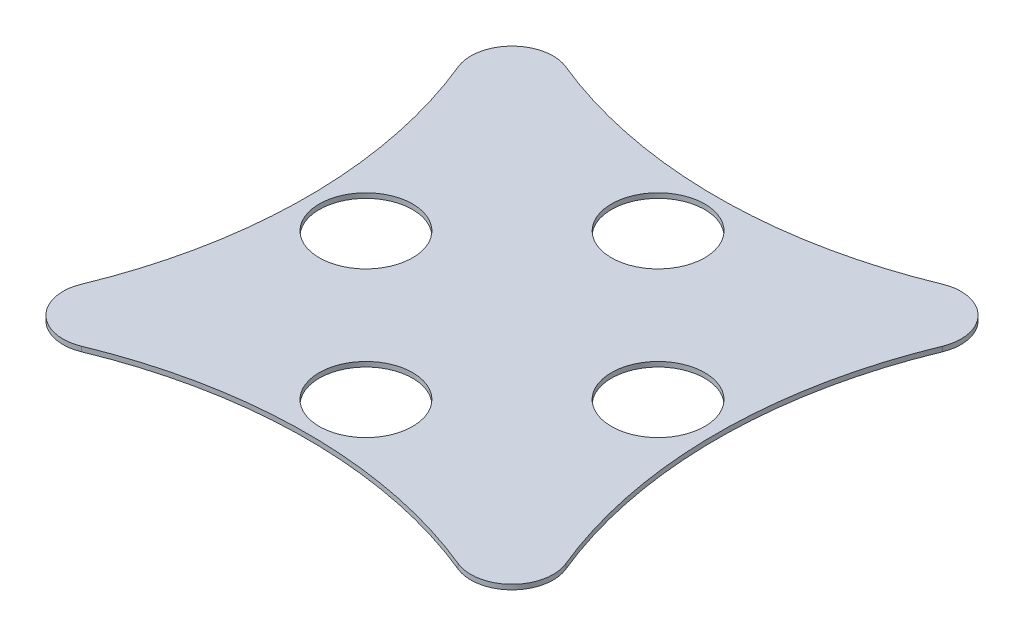
ISO-10303-21;
HEADER;
FILE_DESCRIPTION(('STEP AP214'),'2;1');
FILE_NAME('part.step','',(''),(''),'','','');
FILE_SCHEMA(('AUTOMOTIVE_DESIGN { 1 0 10303 214 1 1 1 1 }'));
ENDSEC;
DATA;
#1=APPLICATION_CONTEXT('core data for automotive mechanical design processes');
#2=APPLICATION_PROTOCOL_DEFINITION('international standard','automotive_design',2000,#1);
#3=PRODUCT_CONTEXT('',#1,'mechanical');
#4=PRODUCT('Part','Part','',(#3));
#5=PRODUCT_RELATED_PRODUCT_CATEGORY('part','',(#4));
#6=PRODUCT_DEFINITION_FORMATION('','',#4);
#7=PRODUCT_DEFINITION_CONTEXT('part definition',#1,'design');
#8=PRODUCT_DEFINITION('design','',#6,#7);
#9=PRODUCT_DEFINITION_SHAPE('','',#8);
#10=(LENGTH_UNIT() NAMED_UNIT(*) SI_UNIT(.MILLI.,.METRE.));
#11=(NAMED_UNIT(*) PLANE_ANGLE_UNIT() SI_UNIT($,.RADIAN.));
#12=(NAMED_UNIT(*) SI_UNIT($,.STERADIAN.) SOLID_ANGLE_UNIT());
#13=UNCERTAINTY_MEASURE_WITH_UNIT(LENGTH_MEASURE(1.E-05),#10,'distance_accuracy_value','');
#14=(GEOMETRIC_REPRESENTATION_CONTEXT(3) GLOBAL_UNCERTAINTY_ASSIGNED_CONTEXT((#13)) GLOBAL_UNIT_ASSIGNED_CONTEXT((#10,
#11,#12)) REPRESENTATION_CONTEXT('',''));
#15=CARTESIAN_POINT('',(0.,0.,0.));
#16=DIRECTION('',(0.,0.,1.));
#17=DIRECTION('',(1.,0.,0.));
#18=AXIS2_PLACEMENT_3D('',#15,#16,#17);
#19=CARTESIAN_POINT('',(-2.22044604925031E-13,3.,-430.999665585436));
#20=DIRECTION('',(0.,-1.,0.));
#21=DIRECTION('',(0.,0.,-1.));
#22=AXIS2_PLACEMENT_3D('',#19,#20,#21);
#23=CYLINDRICAL_SURFACE('',#22,304.8);
#24=CARTESIAN_POINT('',(-2.22044604925031E-13,3.,-430.999665585436));
#25=DIRECTION('',(0.,1.,0.));
#26=DIRECTION('',(0.,0.,1.));
#27=AXIS2_PLACEMENT_3D('',#24,#25,#26);
#28=CIRCLE('',#27,304.8);
#29=CARTESIAN_POINT('',(-115.969978850324,3.,-149.123799279973));
#30=VERTEX_POINT('',#29);
#31=CARTESIAN_POINT('',(115.969978850323,3.,-149.123799279973));
#32=VERTEX_POINT('',#31);
#33=EDGE_CURVE('E162',#30,#32,#28,.T.);
#34=ORIENTED_EDGE('',*,*,#33,.T.);
#35=DIRECTION('',(0.,-1.,0.));
#36=VECTOR('',#35,1.);
#37=CARTESIAN_POINT('',(115.969978850323,3.,-149.123799279973));
#38=LINE('',#37,#36);
#39=CARTESIAN_POINT('',(115.969978850323,0.,-149.123799279973));
#40=VERTEX_POINT('',#39);
#41=EDGE_CURVE('E120',#32,#40,#38,.T.);
#42=ORIENTED_EDGE('',*,*,#41,.T.);
#43=CARTESIAN_POINT('',(-2.22044604925031E-13,0.,-430.999665585436));
#44=DIRECTION('',(0.,1.,0.));
#45=DIRECTION('',(0.,0.,1.));
#46=AXIS2_PLACEMENT_3D('',#43,#44,#45);
#47=CIRCLE('',#46,304.8);
#48=CARTESIAN_POINT('',(-115.969978850324,0.,-149.123799279973));
#49=VERTEX_POINT('',#48);
#50=EDGE_CURVE('E105',#49,#40,#47,.T.);
#51=ORIENTED_EDGE('',*,*,#50,.F.);
#52=DIRECTION('',(0.,-1.,0.));
#53=VECTOR('',#52,1.);
#54=CARTESIAN_POINT('',(-115.969978850324,3.,-149.123799279973));
#55=LINE('',#54,#53);
#56=EDGE_CURVE('E117',#49,#30,#55,.F.);
#57=ORIENTED_EDGE('',*,*,#56,.T.);
#58=EDGE_LOOP('',(#34,#42,#51,#57));
#59=FACE_BOUND('',#58,.T.);
#60=ADVANCED_FACE('F35',(#59),#23,.F.);
#61=CARTESIAN_POINT('',(-430.999665585436,3.,0.));
#62=DIRECTION('',(0.,-1.,0.));
#63=DIRECTION('',(0.,0.,-1.));
#64=AXIS2_PLACEMENT_3D('',#61,#62,#63);
#65=CYLINDRICAL_SURFACE('',#64,304.8);
#66=CARTESIAN_POINT('',(-430.999665585436,3.,0.));
#67=DIRECTION('',(0.,1.,0.));
#68=DIRECTION('',(0.,0.,1.));
#69=AXIS2_PLACEMENT_3D('',#66,#67,#68);
#70=CIRCLE('',#69,304.8);
#71=CARTESIAN_POINT('',(-149.123799279973,3.,-115.969978850324));
#72=VERTEX_POINT('',#71);
#73=CARTESIAN_POINT('',(-149.123799279973,3.,115.969978850324));
#74=VERTEX_POINT('',#73);
#75=EDGE_CURVE('E158',#72,#74,#70,.F.);
#76=ORIENTED_EDGE('',*,*,#75,.F.);
#77=DIRECTION('',(0.,-1.,0.));
#78=VECTOR('',#77,1.);
#79=CARTESIAN_POINT('',(-149.123799279973,3.,-115.969978850324));
#80=LINE('',#79,#78);
#81=CARTESIAN_POINT('',(-149.123799279973,0.,-115.969978850324));
#82=VERTEX_POINT('',#81);
#83=EDGE_CURVE('E11',#72,#82,#80,.T.);
#84=ORIENTED_EDGE('',*,*,#83,.T.);
#85=CARTESIAN_POINT('',(-430.999665585436,0.,0.));
#86=DIRECTION('',(0.,1.,0.));
#87=DIRECTION('',(0.,0.,1.));
#88=AXIS2_PLACEMENT_3D('',#85,#86,#87);
#89=CIRCLE('',#88,304.8);
#90=CARTESIAN_POINT('',(-149.123799279973,0.,115.969978850324));
#91=VERTEX_POINT('',#90);
#92=EDGE_CURVE('E107',#82,#91,#89,.F.);
#93=ORIENTED_EDGE('',*,*,#92,.T.);
#94=DIRECTION('',(0.,-1.,0.));
#95=VECTOR('',#94,1.);
#96=CARTESIAN_POINT('',(-149.123799279973,3.,115.969978850324));
#97=LINE('',#96,#95);
#98=EDGE_CURVE('E43',#91,#74,#97,.F.);
#99=ORIENTED_EDGE('',*,*,#98,.T.);
#100=EDGE_LOOP('',(#76,#84,#93,#99));
#101=FACE_BOUND('',#100,.T.);
#102=ADVANCED_FACE('F157',(#101),#65,.F.);
#103=CARTESIAN_POINT('',(3.33066907387547E-13,3.,430.999665585436));
#104=DIRECTION('',(0.,-1.,0.));
#105=DIRECTION('',(0.,0.,-1.));
#106=AXIS2_PLACEMENT_3D('',#103,#104,#105);
#107=CYLINDRICAL_SURFACE('',#106,304.8);
#108=CARTESIAN_POINT('',(3.33066907387547E-13,0.,430.999665585436));
#109=DIRECTION('',(0.,1.,0.));
#110=DIRECTION('',(0.,0.,1.));
#111=AXIS2_PLACEMENT_3D('',#108,#109,#110);
#112=CIRCLE('',#111,304.8);
#113=CARTESIAN_POINT('',(-115.969978850324,0.,149.123799279973));
#114=VERTEX_POINT('',#113);
#115=CARTESIAN_POINT('',(115.969978850323,0.,149.123799279972));
#116=VERTEX_POINT('',#115);
#117=EDGE_CURVE('E167',#114,#116,#112,.F.);
#118=ORIENTED_EDGE('',*,*,#117,.T.);
#119=DIRECTION('',(0.,-1.,0.));
#120=VECTOR('',#119,1.);
#121=CARTESIAN_POINT('',(115.969978850323,3.,149.123799279972));
#122=LINE('',#121,#120);
#123=CARTESIAN_POINT('',(115.969978850323,3.,149.123799279972));
#124=VERTEX_POINT('',#123);
#125=EDGE_CURVE('E50',#116,#124,#122,.F.);
#126=ORIENTED_EDGE('',*,*,#125,.T.);
#127=CARTESIAN_POINT('',(3.33066907387547E-13,3.,430.999665585436));
#128=DIRECTION('',(0.,1.,0.));
#129=DIRECTION('',(0.,0.,1.));
#130=AXIS2_PLACEMENT_3D('',#127,#128,#129);
#131=CIRCLE('',#130,304.8);
#132=CARTESIAN_POINT('',(-115.969978850324,3.,149.123799279973));
#133=VERTEX_POINT('',#132);
#134=EDGE_CURVE('E130',#133,#124,#131,.F.);
#135=ORIENTED_EDGE('',*,*,#134,.F.);
#136=DIRECTION('',(0.,-1.,0.));
#137=VECTOR('',#136,1.);
#138=CARTESIAN_POINT('',(-115.969978850324,3.,149.123799279973));
#139=LINE('',#138,#137);
#140=EDGE_CURVE('E151',#133,#114,#139,.T.);
#141=ORIENTED_EDGE('',*,*,#140,.T.);
#142=EDGE_LOOP('',(#118,#126,#135,#141));
#143=FACE_BOUND('',#142,.T.);
#144=ADVANCED_FACE('F166',(#143),#107,.F.);
#145=CARTESIAN_POINT('',(430.999665585436,3.,0.));
#146=DIRECTION('',(0.,-1.,0.));
#147=DIRECTION('',(0.,0.,-1.));
#148=AXIS2_PLACEMENT_3D('',#145,#146,#147);
#149=CYLINDRICAL_SURFACE('',#148,304.8);
#150=CARTESIAN_POINT('',(430.999665585436,0.,0.));
#151=DIRECTION('',(0.,1.,0.));
#152=DIRECTION('',(0.,0.,1.));
#153=AXIS2_PLACEMENT_3D('',#150,#151,#152);
#154=CIRCLE('',#153,304.8);
#155=CARTESIAN_POINT('',(149.123799279972,0.,-115.969978850324));
#156=VERTEX_POINT('',#155);
#157=CARTESIAN_POINT('',(149.123799279972,0.,115.969978850323));
#158=VERTEX_POINT('',#157);
#159=EDGE_CURVE('E133',#156,#158,#154,.T.);
#160=ORIENTED_EDGE('',*,*,#159,.F.);
#161=DIRECTION('',(0.,-1.,0.));
#162=VECTOR('',#161,1.);
#163=CARTESIAN_POINT('',(149.123799279972,3.,-115.969978850324));
#164=LINE('',#163,#162);
#165=CARTESIAN_POINT('',(149.123799279972,3.,-115.969978850324));
#166=VERTEX_POINT('',#165);
#167=EDGE_CURVE('E143',#156,#166,#164,.F.);
#168=ORIENTED_EDGE('',*,*,#167,.T.);
#169=CARTESIAN_POINT('',(430.999665585436,3.,0.));
#170=DIRECTION('',(0.,1.,0.));
#171=DIRECTION('',(0.,0.,1.));
#172=AXIS2_PLACEMENT_3D('',#169,#170,#171);
#173=CIRCLE('',#172,304.8);
#174=CARTESIAN_POINT('',(149.123799279972,3.,115.969978850323));
#175=VERTEX_POINT('',#174);
#176=EDGE_CURVE('E126',#166,#175,#173,.T.);
#177=ORIENTED_EDGE('',*,*,#176,.T.);
#178=DIRECTION('',(0.,-1.,0.));
#179=VECTOR('',#178,1.);
#180=CARTESIAN_POINT('',(149.123799279972,3.,115.969978850323));
#181=LINE('',#180,#179);
#182=EDGE_CURVE('E140',#175,#158,#181,.T.);
#183=ORIENTED_EDGE('',*,*,#182,.T.);
#184=EDGE_LOOP('',(#160,#168,#177,#183));
#185=FACE_BOUND('',#184,.T.);
#186=ADVANCED_FACE('F208',(#185),#149,.F.);
#187=CARTESIAN_POINT('',(0.,3.,0.));
#188=DIRECTION('',(0.,1.,0.));
#189=DIRECTION('',(0.,0.,1.));
#190=AXIS2_PLACEMENT_3D('',#187,#188,#189);
#191=PLANE('',#190);
#192=CARTESIAN_POINT('',(-3.14233320495882E-13,3.,90.));
#193=DIRECTION('',(0.,1.,0.));
#194=DIRECTION('',(-1.,0.,0.));
#195=AXIS2_PLACEMENT_3D('',#192,#193,#194);
#196=CIRCLE('',#195,28.75);
#197=CARTESIAN_POINT('',(-28.7500000000003,3.,89.9999999999999));
#198=VERTEX_POINT('',#197);
#199=EDGE_CURVE('E191',#198,#198,#196,.T.);
#200=ORIENTED_EDGE('',*,*,#199,.F.);
#201=EDGE_LOOP('',(#200));
#202=FACE_BOUND('',#201,.T.);
#203=CARTESIAN_POINT('',(-90.,3.,0.));
#204=DIRECTION('',(0.,1.,0.));
#205=DIRECTION('',(0.,0.,-1.));
#206=AXIS2_PLACEMENT_3D('',#203,#204,#205);
#207=CIRCLE('',#206,28.75);
#208=CARTESIAN_POINT('',(-90.,3.,-28.75));
#209=VERTEX_POINT('',#208);
#210=EDGE_CURVE('E185',#209,#209,#207,.T.);
#211=ORIENTED_EDGE('',*,*,#210,.F.);
#212=EDGE_LOOP('',(#211));
#213=FACE_BOUND('',#212,.T.);
#214=CARTESIAN_POINT('',(9.42699961487646E-13,3.,-90.));
#215=DIRECTION('',(0.,1.,0.));
#216=DIRECTION('',(1.,0.,0.));
#217=AXIS2_PLACEMENT_3D('',#214,#215,#216);
#218=CIRCLE('',#217,28.75);
#219=CARTESIAN_POINT('',(28.7500000000009,3.,-89.9999999999997));
#220=VERTEX_POINT('',#219);
#221=EDGE_CURVE('E179',#220,#220,#218,.T.);
#222=ORIENTED_EDGE('',*,*,#221,.F.);
#223=EDGE_LOOP('',(#222));
#224=FACE_BOUND('',#223,.T.);
#225=CARTESIAN_POINT('',(90.,3.,0.));
#226=DIRECTION('',(0.,1.,0.));
#227=DIRECTION('',(0.,0.,1.));
#228=AXIS2_PLACEMENT_3D('',#225,#226,#227);
#229=CIRCLE('',#228,28.75);
#230=CARTESIAN_POINT('',(90.,3.,28.75));
#231=VERTEX_POINT('',#230);
#232=EDGE_CURVE('E173',#231,#231,#229,.T.);
#233=ORIENTED_EDGE('',*,*,#232,.F.);
#234=EDGE_LOOP('',(#233));
#235=FACE_BOUND('',#234,.T.);
#236=ORIENTED_EDGE('',*,*,#176,.F.);
#237=CARTESIAN_POINT('',(125.634143754517,3.,-125.634143754517));
#238=DIRECTION('',(0.,1.,0.));
#239=DIRECTION('',(0.,0.,1.));
#240=AXIS2_PLACEMENT_3D('',#237,#238,#239);
#241=CIRCLE('',#240,25.4);
#242=EDGE_CURVE('E149',#166,#32,#241,.T.);
#243=ORIENTED_EDGE('',*,*,#242,.T.);
#244=ORIENTED_EDGE('',*,*,#33,.F.);
#245=CARTESIAN_POINT('',(-125.634143754517,3.,-125.634143754517));
#246=DIRECTION('',(0.,1.,0.));
#247=DIRECTION('',(0.,0.,1.));
#248=AXIS2_PLACEMENT_3D('',#245,#246,#247);
#249=CIRCLE('',#248,25.4);
#250=EDGE_CURVE('E125',#30,#72,#249,.T.);
#251=ORIENTED_EDGE('',*,*,#250,.T.);
#252=ORIENTED_EDGE('',*,*,#75,.T.);
#253=CARTESIAN_POINT('',(-125.634143754517,3.,125.634143754517));
#254=DIRECTION('',(0.,1.,0.));
#255=DIRECTION('',(0.,0.,1.));
#256=AXIS2_PLACEMENT_3D('',#253,#254,#255);
#257=CIRCLE('',#256,25.4);
#258=EDGE_CURVE('E57',#74,#133,#257,.T.);
#259=ORIENTED_EDGE('',*,*,#258,.T.);
#260=ORIENTED_EDGE('',*,*,#134,.T.);
#261=CARTESIAN_POINT('',(125.634143754517,3.,125.634143754517));
#262=DIRECTION('',(0.,1.,0.));
#263=DIRECTION('',(0.,0.,1.));
#264=AXIS2_PLACEMENT_3D('',#261,#262,#263);
#265=CIRCLE('',#264,25.4);
#266=EDGE_CURVE('E147',#124,#175,#265,.T.);
#267=ORIENTED_EDGE('',*,*,#266,.T.);
#268=EDGE_LOOP('',(#236,#243,#244,#251,#252,#259,#260,#267));
#269=FACE_BOUND('',#268,.T.);
#270=ADVANCED_FACE('F161',(#202,#213,#224,#235,#269),#191,.T.);
#271=CARTESIAN_POINT('',(0.,0.,0.));
#272=DIRECTION('',(0.,1.,0.));
#273=DIRECTION('',(0.,0.,1.));
#274=AXIS2_PLACEMENT_3D('',#271,#272,#273);
#275=PLANE('',#274);
#276=CARTESIAN_POINT('',(-3.14233320495882E-13,0.,90.));
#277=DIRECTION('',(0.,1.,0.));
#278=DIRECTION('',(-1.,0.,0.));
#279=AXIS2_PLACEMENT_3D('',#276,#277,#278);
#280=CIRCLE('',#279,28.75);
#281=CARTESIAN_POINT('',(-28.7500000000003,0.,89.9999999999999));
#282=VERTEX_POINT('',#281);
#283=EDGE_CURVE('E176',#282,#282,#280,.T.);
#284=ORIENTED_EDGE('',*,*,#283,.T.);
#285=EDGE_LOOP('',(#284));
#286=FACE_BOUND('',#285,.T.);
#287=CARTESIAN_POINT('',(-90.,0.,0.));
#288=DIRECTION('',(0.,1.,0.));
#289=DIRECTION('',(0.,0.,-1.));
#290=AXIS2_PLACEMENT_3D('',#287,#288,#289);
#291=CIRCLE('',#290,28.75);
#292=CARTESIAN_POINT('',(-90.,0.,-28.75));
#293=VERTEX_POINT('',#292);
#294=EDGE_CURVE('E188',#293,#293,#291,.T.);
#295=ORIENTED_EDGE('',*,*,#294,.T.);
#296=EDGE_LOOP('',(#295));
#297=FACE_BOUND('',#296,.T.);
#298=CARTESIAN_POINT('',(9.42699961487646E-13,0.,-90.));
#299=DIRECTION('',(0.,1.,0.));
#300=DIRECTION('',(1.,0.,0.));
#301=AXIS2_PLACEMENT_3D('',#298,#299,#300);
#302=CIRCLE('',#301,28.75);
#303=CARTESIAN_POINT('',(28.7500000000009,0.,-89.9999999999997));
#304=VERTEX_POINT('',#303);
#305=EDGE_CURVE('E182',#304,#304,#302,.T.);
#306=ORIENTED_EDGE('',*,*,#305,.T.);
#307=EDGE_LOOP('',(#306));
#308=FACE_BOUND('',#307,.T.);
#309=CARTESIAN_POINT('',(90.,0.,0.));
#310=DIRECTION('',(0.,1.,0.));
#311=DIRECTION('',(0.,0.,1.));
#312=AXIS2_PLACEMENT_3D('',#309,#310,#311);
#313=CIRCLE('',#312,28.75);
#314=CARTESIAN_POINT('',(90.,0.,28.75));
#315=VERTEX_POINT('',#314);
#316=EDGE_CURVE('E121',#315,#315,#313,.T.);
#317=ORIENTED_EDGE('',*,*,#316,.T.);
#318=EDGE_LOOP('',(#317));
#319=FACE_BOUND('',#318,.T.);
#320=ORIENTED_EDGE('',*,*,#50,.T.);
#321=CARTESIAN_POINT('',(125.634143754517,0.,-125.634143754517));
#322=DIRECTION('',(0.,1.,0.));
#323=DIRECTION('',(0.,0.,1.));
#324=AXIS2_PLACEMENT_3D('',#321,#322,#323);
#325=CIRCLE('',#324,25.4);
#326=EDGE_CURVE('E138',#40,#156,#325,.F.);
#327=ORIENTED_EDGE('',*,*,#326,.T.);
#328=ORIENTED_EDGE('',*,*,#159,.T.);
#329=CARTESIAN_POINT('',(125.634143754517,0.,125.634143754517));
#330=DIRECTION('',(0.,1.,0.));
#331=DIRECTION('',(0.,0.,1.));
#332=AXIS2_PLACEMENT_3D('',#329,#330,#331);
#333=CIRCLE('',#332,25.4);
#334=EDGE_CURVE('E111',#158,#116,#333,.F.);
#335=ORIENTED_EDGE('',*,*,#334,.T.);
#336=ORIENTED_EDGE('',*,*,#117,.F.);
#337=CARTESIAN_POINT('',(-125.634143754517,0.,125.634143754517));
#338=DIRECTION('',(0.,1.,0.));
#339=DIRECTION('',(0.,0.,1.));
#340=AXIS2_PLACEMENT_3D('',#337,#338,#339);
#341=CIRCLE('',#340,25.4);
#342=EDGE_CURVE('E112',#114,#91,#341,.F.);
#343=ORIENTED_EDGE('',*,*,#342,.T.);
#344=ORIENTED_EDGE('',*,*,#92,.F.);
#345=CARTESIAN_POINT('',(-125.634143754517,0.,-125.634143754517));
#346=DIRECTION('',(0.,1.,0.));
#347=DIRECTION('',(0.,0.,1.));
#348=AXIS2_PLACEMENT_3D('',#345,#346,#347);
#349=CIRCLE('',#348,25.4);
#350=EDGE_CURVE('E102',#82,#49,#349,.F.);
#351=ORIENTED_EDGE('',*,*,#350,.T.);
#352=EDGE_LOOP('',(#320,#327,#328,#335,#336,#343,#344,#351));
#353=FACE_BOUND('',#352,.T.);
#354=ADVANCED_FACE('F104',(#286,#297,#308,#319,#353),#275,.F.);
#355=CARTESIAN_POINT('',(125.634143754517,3.,-125.634143754517));
#356=DIRECTION('',(0.,-1.,0.));
#357=DIRECTION('',(0.,0.,-1.));
#358=AXIS2_PLACEMENT_3D('',#355,#356,#357);
#359=CYLINDRICAL_SURFACE('',#358,25.4);
#360=ORIENTED_EDGE('',*,*,#242,.F.);
#361=ORIENTED_EDGE('',*,*,#167,.F.);
#362=ORIENTED_EDGE('',*,*,#326,.F.);
#363=ORIENTED_EDGE('',*,*,#41,.F.);
#364=EDGE_LOOP('',(#360,#361,#362,#363));
#365=FACE_BOUND('',#364,.T.);
#366=ADVANCED_FACE('F236',(#365),#359,.T.);
#367=CARTESIAN_POINT('',(125.634143754517,3.,125.634143754517));
#368=DIRECTION('',(0.,-1.,0.));
#369=DIRECTION('',(0.,0.,-1.));
#370=AXIS2_PLACEMENT_3D('',#367,#368,#369);
#371=CYLINDRICAL_SURFACE('',#370,25.4);
#372=ORIENTED_EDGE('',*,*,#266,.F.);
#373=ORIENTED_EDGE('',*,*,#125,.F.);
#374=ORIENTED_EDGE('',*,*,#334,.F.);
#375=ORIENTED_EDGE('',*,*,#182,.F.);
#376=EDGE_LOOP('',(#372,#373,#374,#375));
#377=FACE_BOUND('',#376,.T.);
#378=ADVANCED_FACE('F239',(#377),#371,.T.);
#379=CARTESIAN_POINT('',(-125.634143754517,3.,-125.634143754517));
#380=DIRECTION('',(0.,-1.,0.));
#381=DIRECTION('',(0.,0.,-1.));
#382=AXIS2_PLACEMENT_3D('',#379,#380,#381);
#383=CYLINDRICAL_SURFACE('',#382,25.4);
#384=ORIENTED_EDGE('',*,*,#250,.F.);
#385=ORIENTED_EDGE('',*,*,#56,.F.);
#386=ORIENTED_EDGE('',*,*,#350,.F.);
#387=ORIENTED_EDGE('',*,*,#83,.F.);
#388=EDGE_LOOP('',(#384,#385,#386,#387));
#389=FACE_BOUND('',#388,.T.);
#390=ADVANCED_FACE('F124',(#389),#383,.T.);
#391=CARTESIAN_POINT('',(-125.634143754517,3.,125.634143754517));
#392=DIRECTION('',(0.,-1.,0.));
#393=DIRECTION('',(0.,0.,-1.));
#394=AXIS2_PLACEMENT_3D('',#391,#392,#393);
#395=CYLINDRICAL_SURFACE('',#394,25.4);
#396=ORIENTED_EDGE('',*,*,#258,.F.);
#397=ORIENTED_EDGE('',*,*,#98,.F.);
#398=ORIENTED_EDGE('',*,*,#342,.F.);
#399=ORIENTED_EDGE('',*,*,#140,.F.);
#400=EDGE_LOOP('',(#396,#397,#398,#399));
#401=FACE_BOUND('',#400,.T.);
#402=ADVANCED_FACE('F37',(#401),#395,.T.);
#403=CARTESIAN_POINT('',(90.,0.,0.));
#404=DIRECTION('',(0.,1.,0.));
#405=DIRECTION('',(0.,0.,1.));
#406=AXIS2_PLACEMENT_3D('',#403,#404,#405);
#407=CYLINDRICAL_SURFACE('',#406,28.75);
#408=ORIENTED_EDGE('',*,*,#316,.F.);
#409=EDGE_LOOP('',(#408));
#410=FACE_BOUND('',#409,.T.);
#411=ORIENTED_EDGE('',*,*,#232,.T.);
#412=EDGE_LOOP('',(#411));
#413=FACE_BOUND('',#412,.T.);
#414=ADVANCED_FACE('F216',(#410,#413),#407,.F.);
#415=CARTESIAN_POINT('',(9.42699961487646E-13,0.,-90.));
#416=DIRECTION('',(0.,1.,0.));
#417=DIRECTION('',(0.,0.,1.));
#418=AXIS2_PLACEMENT_3D('',#415,#416,#417);
#419=CYLINDRICAL_SURFACE('',#418,28.75);
#420=ORIENTED_EDGE('',*,*,#305,.F.);
#421=EDGE_LOOP('',(#420));
#422=FACE_BOUND('',#421,.T.);
#423=ORIENTED_EDGE('',*,*,#221,.T.);
#424=EDGE_LOOP('',(#423));
#425=FACE_BOUND('',#424,.T.);
#426=ADVANCED_FACE('F218',(#422,#425),#419,.F.);
#427=CARTESIAN_POINT('',(-90.,0.,0.));
#428=DIRECTION('',(0.,1.,0.));
#429=DIRECTION('',(0.,0.,1.));
#430=AXIS2_PLACEMENT_3D('',#427,#428,#429);
#431=CYLINDRICAL_SURFACE('',#430,28.75);
#432=ORIENTED_EDGE('',*,*,#294,.F.);
#433=EDGE_LOOP('',(#432));
#434=FACE_BOUND('',#433,.T.);
#435=ORIENTED_EDGE('',*,*,#210,.T.);
#436=EDGE_LOOP('',(#435));
#437=FACE_BOUND('',#436,.T.);
#438=ADVANCED_FACE('F202',(#434,#437),#431,.F.);
#439=CARTESIAN_POINT('',(-3.14233320495882E-13,0.,90.));
#440=DIRECTION('',(0.,1.,0.));
#441=DIRECTION('',(0.,0.,1.));
#442=AXIS2_PLACEMENT_3D('',#439,#440,#441);
#443=CYLINDRICAL_SURFACE('',#442,28.75);
#444=ORIENTED_EDGE('',*,*,#283,.F.);
#445=EDGE_LOOP('',(#444));
#446=FACE_BOUND('',#445,.T.);
#447=ORIENTED_EDGE('',*,*,#199,.T.);
#448=EDGE_LOOP('',(#447));
#449=FACE_BOUND('',#448,.T.);
#450=ADVANCED_FACE('F199',(#446,#449),#443,.F.);
#451=CLOSED_SHELL('',(#60,#102,#144,#186,#270,#354,#366,#378,#390,#402,#414,#426,#438,#450));
#452=MANIFOLD_SOLID_BREP('B2',#451);
#453=ADVANCED_BREP_SHAPE_REPRESENTATION('',(#18,#452),#14);
#454=SHAPE_DEFINITION_REPRESENTATION(#9,#453);
ENDSEC;
END-ISO-10303-21;
